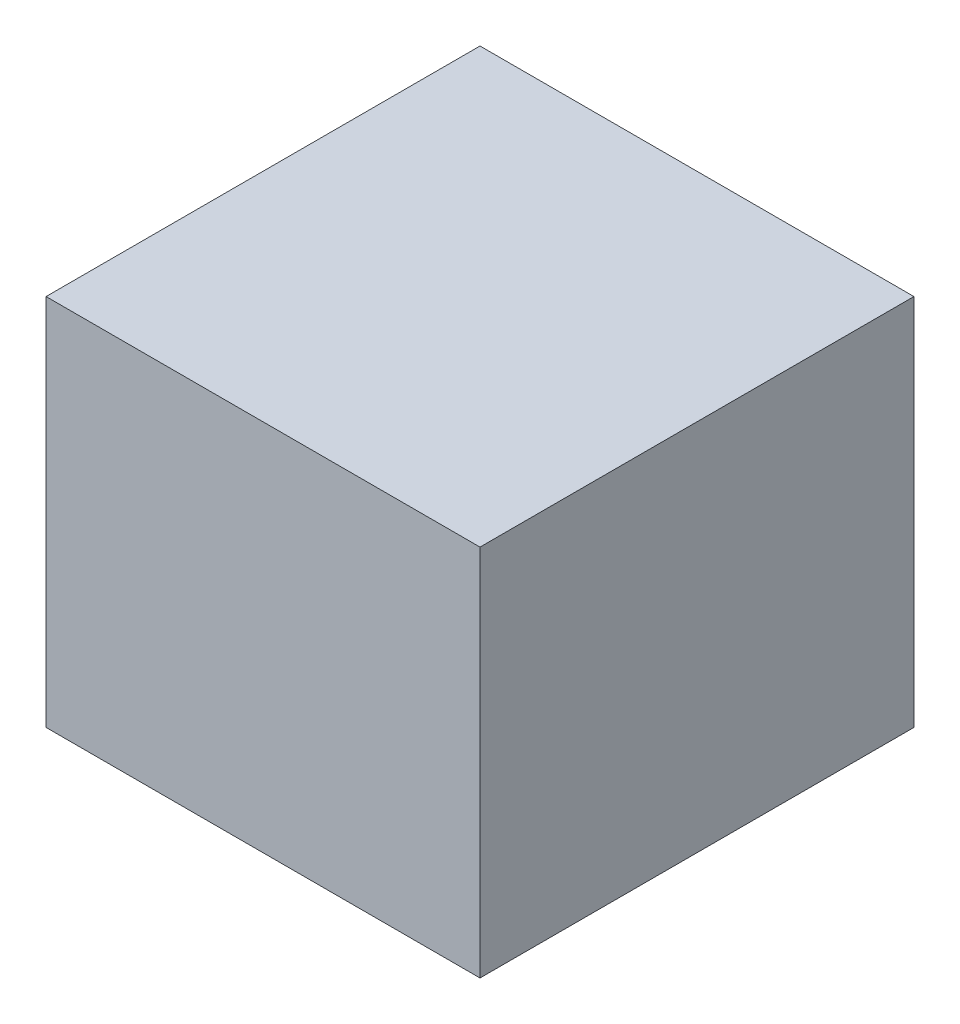
ISO-10303-21;
HEADER;
FILE_DESCRIPTION(('STEP AP214'),'2;1');
FILE_NAME('part.step','',(''),(''),'','','');
FILE_SCHEMA(('AUTOMOTIVE_DESIGN { 1 0 10303 214 1 1 1 1 }'));
ENDSEC;
DATA;
#1=APPLICATION_CONTEXT('core data for automotive mechanical design processes');
#2=APPLICATION_PROTOCOL_DEFINITION('international standard','automotive_design',2000,#1);
#3=PRODUCT_CONTEXT('',#1,'mechanical');
#4=PRODUCT('Part','Part','',(#3));
#5=PRODUCT_RELATED_PRODUCT_CATEGORY('part','',(#4));
#6=PRODUCT_DEFINITION_FORMATION('','',#4);
#7=PRODUCT_DEFINITION_CONTEXT('part definition',#1,'design');
#8=PRODUCT_DEFINITION('design','',#6,#7);
#9=PRODUCT_DEFINITION_SHAPE('','',#8);
#10=(LENGTH_UNIT() NAMED_UNIT(*) SI_UNIT(.MILLI.,.METRE.));
#11=(NAMED_UNIT(*) PLANE_ANGLE_UNIT() SI_UNIT($,.RADIAN.));
#12=(NAMED_UNIT(*) SI_UNIT($,.STERADIAN.) SOLID_ANGLE_UNIT());
#13=UNCERTAINTY_MEASURE_WITH_UNIT(LENGTH_MEASURE(1.E-05),#10,'distance_accuracy_value','');
#14=(GEOMETRIC_REPRESENTATION_CONTEXT(3) GLOBAL_UNCERTAINTY_ASSIGNED_CONTEXT((#13)) GLOBAL_UNIT_ASSIGNED_CONTEXT((#10,
#11,#12)) REPRESENTATION_CONTEXT('',''));
#15=CARTESIAN_POINT('',(0.,0.,0.));
#16=DIRECTION('',(0.,0.,1.));
#17=DIRECTION('',(1.,0.,0.));
#18=AXIS2_PLACEMENT_3D('',#15,#16,#17);
#19=CARTESIAN_POINT('',(0.,0.,0.));
#20=DIRECTION('',(0.,1.,0.));
#21=DIRECTION('',(1.,0.,0.));
#22=AXIS2_PLACEMENT_3D('',#19,#20,#21);
#23=PLANE('',#22);
#24=DIRECTION('',(0.,0.,1.));
#25=VECTOR('',#24,1.);
#26=CARTESIAN_POINT('',(-25.,0.,25.));
#27=LINE('',#26,#25);
#28=CARTESIAN_POINT('',(-25.,0.,-25.));
#29=VERTEX_POINT('',#28);
#30=CARTESIAN_POINT('',(-25.,0.,25.));
#31=VERTEX_POINT('',#30);
#32=EDGE_CURVE('E84',#29,#31,#27,.T.);
#33=ORIENTED_EDGE('',*,*,#32,.F.);
#34=DIRECTION('',(-1.,0.,0.));
#35=VECTOR('',#34,1.);
#36=CARTESIAN_POINT('',(25.,0.,-25.));
#37=LINE('',#36,#35);
#38=CARTESIAN_POINT('',(25.,0.,-25.));
#39=VERTEX_POINT('',#38);
#40=EDGE_CURVE('E26',#39,#29,#37,.T.);
#41=ORIENTED_EDGE('',*,*,#40,.F.);
#42=DIRECTION('',(0.,0.,-1.));
#43=VECTOR('',#42,1.);
#44=CARTESIAN_POINT('',(25.,0.,25.));
#45=LINE('',#44,#43);
#46=CARTESIAN_POINT('',(25.,0.,25.));
#47=VERTEX_POINT('',#46);
#48=EDGE_CURVE('E106',#47,#39,#45,.T.);
#49=ORIENTED_EDGE('',*,*,#48,.F.);
#50=DIRECTION('',(1.,0.,0.));
#51=VECTOR('',#50,1.);
#52=CARTESIAN_POINT('',(25.,0.,25.));
#53=LINE('',#52,#51);
#54=EDGE_CURVE('E88',#31,#47,#53,.T.);
#55=ORIENTED_EDGE('',*,*,#54,.F.);
#56=EDGE_LOOP('',(#33,#41,#49,#55));
#57=FACE_BOUND('',#56,.T.);
#58=ADVANCED_FACE('F17',(#57),#23,.F.);
#59=CARTESIAN_POINT('',(0.,43.,0.));
#60=DIRECTION('',(0.,1.,0.));
#61=DIRECTION('',(1.,0.,0.));
#62=AXIS2_PLACEMENT_3D('',#59,#60,#61);
#63=PLANE('',#62);
#64=DIRECTION('',(0.,0.,1.));
#65=VECTOR('',#64,1.);
#66=CARTESIAN_POINT('',(-25.,43.,25.));
#67=LINE('',#66,#65);
#68=CARTESIAN_POINT('',(-25.,43.,-25.));
#69=VERTEX_POINT('',#68);
#70=CARTESIAN_POINT('',(-25.,43.,25.));
#71=VERTEX_POINT('',#70);
#72=EDGE_CURVE('E86',#69,#71,#67,.T.);
#73=ORIENTED_EDGE('',*,*,#72,.T.);
#74=DIRECTION('',(1.,0.,0.));
#75=VECTOR('',#74,1.);
#76=CARTESIAN_POINT('',(25.,43.,25.));
#77=LINE('',#76,#75);
#78=CARTESIAN_POINT('',(25.,43.,25.));
#79=VERTEX_POINT('',#78);
#80=EDGE_CURVE('E113',#71,#79,#77,.T.);
#81=ORIENTED_EDGE('',*,*,#80,.T.);
#82=DIRECTION('',(0.,0.,-1.));
#83=VECTOR('',#82,1.);
#84=CARTESIAN_POINT('',(25.,43.,25.));
#85=LINE('',#84,#83);
#86=CARTESIAN_POINT('',(25.,43.,-25.));
#87=VERTEX_POINT('',#86);
#88=EDGE_CURVE('E78',#79,#87,#85,.T.);
#89=ORIENTED_EDGE('',*,*,#88,.T.);
#90=DIRECTION('',(-1.,0.,0.));
#91=VECTOR('',#90,1.);
#92=CARTESIAN_POINT('',(25.,43.,-25.));
#93=LINE('',#92,#91);
#94=EDGE_CURVE('E11',#87,#69,#93,.T.);
#95=ORIENTED_EDGE('',*,*,#94,.T.);
#96=EDGE_LOOP('',(#73,#81,#89,#95));
#97=FACE_BOUND('',#96,.T.);
#98=ADVANCED_FACE('F19',(#97),#63,.T.);
#99=CARTESIAN_POINT('',(25.,43.,-25.));
#100=DIRECTION('',(0.,0.,1.));
#101=DIRECTION('',(1.,0.,0.));
#102=AXIS2_PLACEMENT_3D('',#99,#100,#101);
#103=PLANE('',#102);
#104=ORIENTED_EDGE('',*,*,#40,.T.);
#105=DIRECTION('',(0.,-1.,0.));
#106=VECTOR('',#105,1.);
#107=CARTESIAN_POINT('',(-25.,43.,-25.));
#108=LINE('',#107,#106);
#109=EDGE_CURVE('E72',#69,#29,#108,.T.);
#110=ORIENTED_EDGE('',*,*,#109,.F.);
#111=ORIENTED_EDGE('',*,*,#94,.F.);
#112=DIRECTION('',(0.,-1.,0.));
#113=VECTOR('',#112,1.);
#114=CARTESIAN_POINT('',(25.,43.,-25.));
#115=LINE('',#114,#113);
#116=EDGE_CURVE('E75',#87,#39,#115,.T.);
#117=ORIENTED_EDGE('',*,*,#116,.T.);
#118=EDGE_LOOP('',(#104,#110,#111,#117));
#119=FACE_BOUND('',#118,.T.);
#120=ADVANCED_FACE('F71',(#119),#103,.F.);
#121=CARTESIAN_POINT('',(25.,43.,25.));
#122=DIRECTION('',(-1.,0.,0.));
#123=DIRECTION('',(0.,0.,1.));
#124=AXIS2_PLACEMENT_3D('',#121,#122,#123);
#125=PLANE('',#124);
#126=ORIENTED_EDGE('',*,*,#48,.T.);
#127=ORIENTED_EDGE('',*,*,#116,.F.);
#128=ORIENTED_EDGE('',*,*,#88,.F.);
#129=DIRECTION('',(0.,-1.,0.));
#130=VECTOR('',#129,1.);
#131=CARTESIAN_POINT('',(25.,43.,25.));
#132=LINE('',#131,#130);
#133=EDGE_CURVE('E102',#79,#47,#132,.T.);
#134=ORIENTED_EDGE('',*,*,#133,.T.);
#135=EDGE_LOOP('',(#126,#127,#128,#134));
#136=FACE_BOUND('',#135,.T.);
#137=ADVANCED_FACE('F119',(#136),#125,.F.);
#138=CARTESIAN_POINT('',(25.,43.,25.));
#139=DIRECTION('',(0.,0.,-1.));
#140=DIRECTION('',(-1.,0.,0.));
#141=AXIS2_PLACEMENT_3D('',#138,#139,#140);
#142=PLANE('',#141);
#143=ORIENTED_EDGE('',*,*,#54,.T.);
#144=ORIENTED_EDGE('',*,*,#133,.F.);
#145=ORIENTED_EDGE('',*,*,#80,.F.);
#146=DIRECTION('',(0.,-1.,0.));
#147=VECTOR('',#146,1.);
#148=CARTESIAN_POINT('',(-25.,43.,25.));
#149=LINE('',#148,#147);
#150=EDGE_CURVE('E93',#71,#31,#149,.T.);
#151=ORIENTED_EDGE('',*,*,#150,.T.);
#152=EDGE_LOOP('',(#143,#144,#145,#151));
#153=FACE_BOUND('',#152,.T.);
#154=ADVANCED_FACE('F122',(#153),#142,.F.);
#155=CARTESIAN_POINT('',(-25.,43.,25.));
#156=DIRECTION('',(1.,0.,0.));
#157=DIRECTION('',(0.,1.,0.));
#158=AXIS2_PLACEMENT_3D('',#155,#156,#157);
#159=PLANE('',#158);
#160=ORIENTED_EDGE('',*,*,#32,.T.);
#161=ORIENTED_EDGE('',*,*,#150,.F.);
#162=ORIENTED_EDGE('',*,*,#72,.F.);
#163=ORIENTED_EDGE('',*,*,#109,.T.);
#164=EDGE_LOOP('',(#160,#161,#162,#163));
#165=FACE_BOUND('',#164,.T.);
#166=ADVANCED_FACE('F82',(#165),#159,.F.);
#167=CLOSED_SHELL('',(#58,#98,#120,#137,#154,#166));
#168=MANIFOLD_SOLID_BREP('B1',#167);
#169=ADVANCED_BREP_SHAPE_REPRESENTATION('',(#18,#168),#14);
#170=SHAPE_DEFINITION_REPRESENTATION(#9,#169);
ENDSEC;
END-ISO-10303-21;
